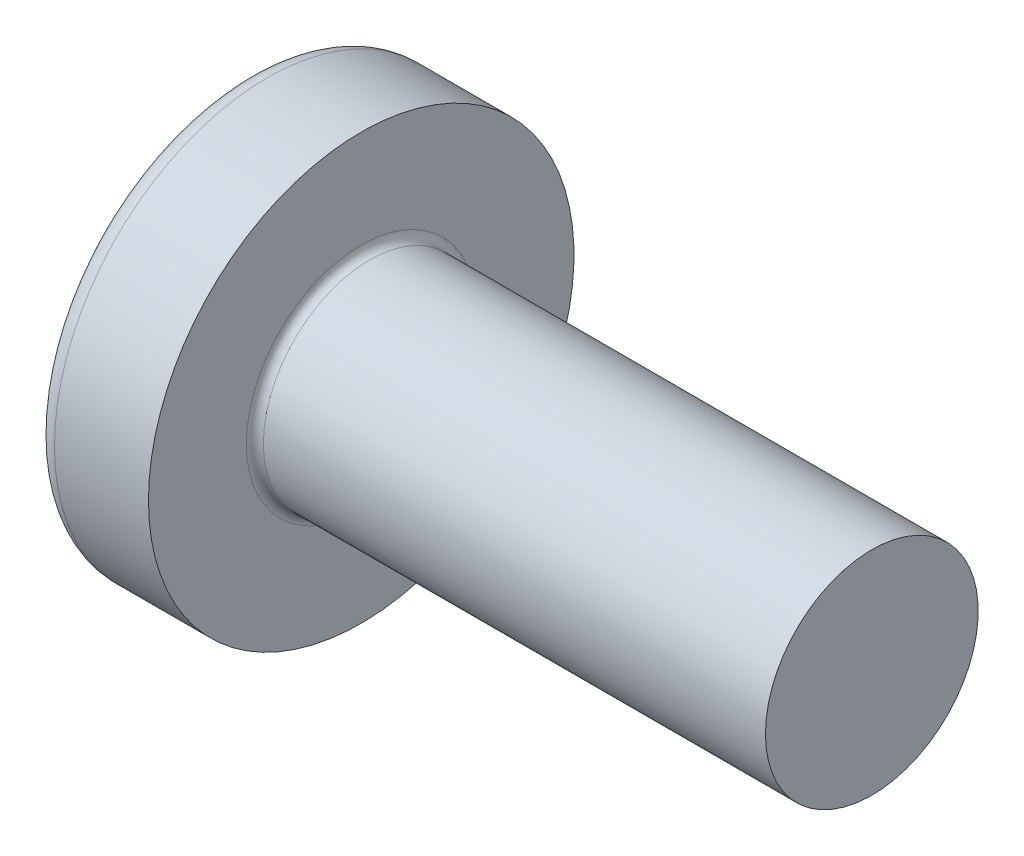
ISO-10303-21;
HEADER;
FILE_DESCRIPTION(('STEP AP214'),'2;1');
FILE_NAME('part.step','',(''),(''),'','','');
FILE_SCHEMA(('AUTOMOTIVE_DESIGN { 1 0 10303 214 1 1 1 1 }'));
ENDSEC;
DATA;
#1=APPLICATION_CONTEXT('core data for automotive mechanical design processes');
#2=APPLICATION_PROTOCOL_DEFINITION('international standard','automotive_design',2000,#1);
#3=PRODUCT_CONTEXT('',#1,'mechanical');
#4=PRODUCT('Part','Part','',(#3));
#5=PRODUCT_RELATED_PRODUCT_CATEGORY('part','',(#4));
#6=PRODUCT_DEFINITION_FORMATION('','',#4);
#7=PRODUCT_DEFINITION_CONTEXT('part definition',#1,'design');
#8=PRODUCT_DEFINITION('design','',#6,#7);
#9=PRODUCT_DEFINITION_SHAPE('','',#8);
#10=(LENGTH_UNIT() NAMED_UNIT(*) SI_UNIT(.MILLI.,.METRE.));
#11=(NAMED_UNIT(*) PLANE_ANGLE_UNIT() SI_UNIT($,.RADIAN.));
#12=(NAMED_UNIT(*) SI_UNIT($,.STERADIAN.) SOLID_ANGLE_UNIT());
#13=UNCERTAINTY_MEASURE_WITH_UNIT(LENGTH_MEASURE(1.E-05),#10,'distance_accuracy_value','');
#14=(GEOMETRIC_REPRESENTATION_CONTEXT(3) GLOBAL_UNCERTAINTY_ASSIGNED_CONTEXT((#13)) GLOBAL_UNIT_ASSIGNED_CONTEXT((#10,
#11,#12)) REPRESENTATION_CONTEXT('',''));
#15=CARTESIAN_POINT('',(0.,0.,0.));
#16=DIRECTION('',(0.,0.,1.));
#17=DIRECTION('',(1.,0.,0.));
#18=AXIS2_PLACEMENT_3D('',#15,#16,#17);
#19=CARTESIAN_POINT('',(4.,0.,0.));
#20=DIRECTION('',(-1.,0.,0.));
#21=DIRECTION('',(0.,1.,0.));
#22=AXIS2_PLACEMENT_3D('',#19,#20,#21);
#23=SPHERICAL_SURFACE('',#22,4.);
#24=CARTESIAN_POINT('',(0.803195914613464,0.,0.));
#25=DIRECTION('',(-1.,0.,0.));
#26=DIRECTION('',(0.,0.,1.));
#27=AXIS2_PLACEMENT_3D('',#24,#25,#26);
#28=CIRCLE('',#27,2.40425531914894);
#29=CARTESIAN_POINT('',(0.803195914613464,0.,2.40425531914894));
#30=VERTEX_POINT('',#29);
#31=EDGE_CURVE('E238',#30,#30,#28,.T.);
#32=ORIENTED_EDGE('',*,*,#31,.T.);
#33=EDGE_LOOP('',(#32));
#34=FACE_BOUND('',#33,.T.);
#35=CARTESIAN_POINT('',(0.0543400780062932,0.,0.));
#36=DIRECTION('',(1.,0.,0.));
#37=DIRECTION('',(0.,0.,-1.));
#38=AXIS2_PLACEMENT_3D('',#35,#36,#37);
#39=CIRCLE('',#38,0.657090389499513);
#40=CARTESIAN_POINT('',(0.0543400780062942,-0.369999999999998,-0.54301729251712));
#41=VERTEX_POINT('',#40);
#42=CARTESIAN_POINT('',(0.0543400780062936,-0.543017292517118,-0.37));
#43=VERTEX_POINT('',#42);
#44=EDGE_CURVE('E374',#41,#43,#39,.F.);
#45=ORIENTED_EDGE('',*,*,#44,.F.);
#46=CARTESIAN_POINT('',(4.,-0.37,0.));
#47=DIRECTION('',(0.,1.,0.));
#48=DIRECTION('',(0.,0.,1.));
#49=AXIS2_PLACEMENT_3D('',#46,#47,#48);
#50=CIRCLE('',#49,3.98285073785097);
#51=CARTESIAN_POINT('',(0.201999111211585,-0.369999999999996,-1.19928697514915));
#52=VERTEX_POINT('',#51);
#53=EDGE_CURVE('E300',#52,#41,#50,.T.);
#54=ORIENTED_EDGE('',*,*,#53,.F.);
#55=CARTESIAN_POINT('',(3.72274328891674,0.,0.556091024961349));
#56=DIRECTION('',(0.446197753347436,0.,-0.894934391398443));
#57=DIRECTION('',(-0.894934391398443,0.,-0.446197753347436));
#58=AXIS2_PLACEMENT_3D('',#55,#56,#57);
#59=CIRCLE('',#58,3.95144169742092);
#60=CARTESIAN_POINT('',(0.201999111211585,0.370000000000004,-1.19928697514915));
#61=VERTEX_POINT('',#60);
#62=EDGE_CURVE('E272',#52,#61,#59,.T.);
#63=ORIENTED_EDGE('',*,*,#62,.T.);
#64=CARTESIAN_POINT('',(4.,0.37,0.));
#65=DIRECTION('',(0.,-1.,0.));
#66=DIRECTION('',(0.,0.,-1.));
#67=AXIS2_PLACEMENT_3D('',#64,#65,#66);
#68=CIRCLE('',#67,3.98285073785097);
#69=CARTESIAN_POINT('',(0.0543400780062934,0.370000000000002,-0.543017292517118));
#70=VERTEX_POINT('',#69);
#71=EDGE_CURVE('E327',#70,#61,#68,.T.);
#72=ORIENTED_EDGE('',*,*,#71,.F.);
#73=CARTESIAN_POINT('',(0.0543400780062936,0.543017292517117,-0.37));
#74=VERTEX_POINT('',#73);
#75=EDGE_CURVE('E393',#74,#70,#39,.F.);
#76=ORIENTED_EDGE('',*,*,#75,.F.);
#77=CARTESIAN_POINT('',(4.,0.,-0.37));
#78=DIRECTION('',(0.,0.,1.));
#79=DIRECTION('',(1.,0.,0.));
#80=AXIS2_PLACEMENT_3D('',#77,#78,#79);
#81=CIRCLE('',#80,3.98285073785097);
#82=CARTESIAN_POINT('',(0.201999111211585,1.19928697514915,-0.37));
#83=VERTEX_POINT('',#82);
#84=EDGE_CURVE('E266',#83,#74,#81,.T.);
#85=ORIENTED_EDGE('',*,*,#84,.F.);
#86=CARTESIAN_POINT('',(3.72274328891675,-0.556091024961349,0.));
#87=DIRECTION('',(0.446197753347436,0.894934391398443,0.));
#88=DIRECTION('',(-0.894934391398443,0.446197753347436,0.));
#89=AXIS2_PLACEMENT_3D('',#86,#87,#88);
#90=CIRCLE('',#89,3.95144169742092);
#91=CARTESIAN_POINT('',(0.201999111211585,1.19928697514915,0.37));
#92=VERTEX_POINT('',#91);
#93=EDGE_CURVE('E269',#83,#92,#90,.T.);
#94=ORIENTED_EDGE('',*,*,#93,.T.);
#95=CARTESIAN_POINT('',(4.,0.,0.37));
#96=DIRECTION('',(0.,0.,-1.));
#97=DIRECTION('',(0.,1.,0.));
#98=AXIS2_PLACEMENT_3D('',#95,#96,#97);
#99=CIRCLE('',#98,3.98285073785097);
#100=CARTESIAN_POINT('',(0.0543400780062936,0.543017292517117,0.37));
#101=VERTEX_POINT('',#100);
#102=EDGE_CURVE('E262',#101,#92,#99,.T.);
#103=ORIENTED_EDGE('',*,*,#102,.F.);
#104=CARTESIAN_POINT('',(0.0543400780062942,0.369999999999998,0.54301729251712));
#105=VERTEX_POINT('',#104);
#106=EDGE_CURVE('E392',#105,#101,#39,.F.);
#107=ORIENTED_EDGE('',*,*,#106,.F.);
#108=CARTESIAN_POINT('',(0.201999111211584,0.369999999999996,1.19928697514916));
#109=VERTEX_POINT('',#108);
#110=EDGE_CURVE('E282',#109,#105,#68,.T.);
#111=ORIENTED_EDGE('',*,*,#110,.F.);
#112=CARTESIAN_POINT('',(3.72274328891674,0.,-0.556091024961349));
#113=DIRECTION('',(0.446197753347436,0.,0.894934391398443));
#114=DIRECTION('',(0.894934391398443,0.,-0.446197753347436));
#115=AXIS2_PLACEMENT_3D('',#112,#113,#114);
#116=CIRCLE('',#115,3.95144169742092);
#117=CARTESIAN_POINT('',(0.201999111211584,-0.370000000000004,1.19928697514915));
#118=VERTEX_POINT('',#117);
#119=EDGE_CURVE('E49',#109,#118,#116,.T.);
#120=ORIENTED_EDGE('',*,*,#119,.T.);
#121=CARTESIAN_POINT('',(0.0543400780062935,-0.370000000000002,0.543017292517118));
#122=VERTEX_POINT('',#121);
#123=EDGE_CURVE('E279',#122,#118,#50,.T.);
#124=ORIENTED_EDGE('',*,*,#123,.F.);
#125=CARTESIAN_POINT('',(0.0543400780062936,-0.543017292517118,0.37));
#126=VERTEX_POINT('',#125);
#127=EDGE_CURVE('E432',#126,#122,#39,.F.);
#128=ORIENTED_EDGE('',*,*,#127,.F.);
#129=CARTESIAN_POINT('',(0.201999111211585,-1.19928697514915,0.37));
#130=VERTEX_POINT('',#129);
#131=EDGE_CURVE('E263',#130,#126,#99,.T.);
#132=ORIENTED_EDGE('',*,*,#131,.F.);
#133=CARTESIAN_POINT('',(3.72274328891674,0.556091024961349,0.));
#134=DIRECTION('',(0.446197753347436,-0.894934391398443,0.));
#135=DIRECTION('',(0.894934391398443,0.446197753347436,0.));
#136=AXIS2_PLACEMENT_3D('',#133,#134,#135);
#137=CIRCLE('',#136,3.95144169742092);
#138=CARTESIAN_POINT('',(0.201999111211585,-1.19928697514915,-0.37));
#139=VERTEX_POINT('',#138);
#140=EDGE_CURVE('E259',#130,#139,#137,.T.);
#141=ORIENTED_EDGE('',*,*,#140,.T.);
#142=EDGE_CURVE('E64',#43,#139,#81,.T.);
#143=ORIENTED_EDGE('',*,*,#142,.F.);
#144=EDGE_LOOP('',(#45,#54,#63,#72,#76,#85,#94,#103,#107,#111,#120,#124,#128,#132,#141,#143));
#145=FACE_BOUND('',#144,.T.);
#146=ADVANCED_FACE('F35',(#34,#145),#23,.T.);
#147=CARTESIAN_POINT('',(1.5,0.552127712987655,-0.37));
#148=DIRECTION('',(0.,0.,1.));
#149=DIRECTION('',(1.,0.,0.));
#150=AXIS2_PLACEMENT_3D('',#147,#148,#149);
#151=PLANE('',#150);
#152=ORIENTED_EDGE('',*,*,#84,.T.);
#153=CARTESIAN_POINT('',(-0.98410748766867,0.628943903399942,-0.37));
#154=CARTESIAN_POINT('',(-0.783603343008974,0.612669947295736,-0.37));
#155=CARTESIAN_POINT('',(-0.583110931104086,0.596248129681141,-0.37));
#156=CARTESIAN_POINT('',(-0.182155788452108,0.562989164841715,-0.37));
#157=CARTESIAN_POINT('',(0.0183069414735531,0.546152007726029,-0.37));
#158=CARTESIAN_POINT('',(0.419186928470486,0.511943523152247,-0.37));
#159=CARTESIAN_POINT('',(0.61960418554543,0.4945721957373,-0.37));
#160=CARTESIAN_POINT('',(1.02037173794706,0.459102589125901,-0.37));
#161=CARTESIAN_POINT('',(1.22072203423871,0.441004320904958,-0.37));
#162=CARTESIAN_POINT('',(1.53631168775258,0.411665443099266,-0.37));
#163=CARTESIAN_POINT('',(1.65158348734209,0.400774467003839,-0.37));
#164=CARTESIAN_POINT('',(1.88208360561815,0.378547148308018,-0.37));
#165=CARTESIAN_POINT('',(1.99731192452822,0.367210808029326,-0.37));
#166=CARTESIAN_POINT('',(2.22771614129237,0.343963614894723,-0.37));
#167=CARTESIAN_POINT('',(2.34289203669079,0.332052737461392,-0.37));
#168=CARTESIAN_POINT('',(2.5731581934851,0.30741320876737,-0.37));
#169=CARTESIAN_POINT('',(2.68824845325022,0.294684542317204,-0.37));
#170=CARTESIAN_POINT('',(2.80327961663798,0.281425340988554,-0.37));
#171=B_SPLINE_CURVE_WITH_KNOTS('',3,(#153,#154,#155,#156,#157,#158,#159,#160,#161,#162,#163,
#164,#165,#166,#167,#168,#169,#170),.UNSPECIFIED.,.F.,.F.,(4,2,2,2,2,2,2,2,4),(0.,
0.603490856265068,1.20699609790343,1.81050129079257,2.41399737525255,2.7613521432415,
3.1087051006963,3.45607293033825,3.80344721379854),.UNSPECIFIED.);
#172=CARTESIAN_POINT('',(1.5,0.415013252800437,-0.370000000000001));
#173=VERTEX_POINT('',#172);
#174=EDGE_CURVE('E416',#74,#173,#171,.T.);
#175=ORIENTED_EDGE('',*,*,#174,.T.);
#176=DIRECTION('',(0.,1.,0.));
#177=VECTOR('',#176,1.);
#178=CARTESIAN_POINT('',(1.5,-0.552127712987656,-0.37));
#179=LINE('',#178,#177);
#180=CARTESIAN_POINT('',(1.5,0.552127712987655,-0.37));
#181=VERTEX_POINT('',#180);
#182=EDGE_CURVE('E356',#173,#181,#179,.T.);
#183=ORIENTED_EDGE('',*,*,#182,.T.);
#184=DIRECTION('',(0.894934391398443,-0.446197753347436,0.));
#185=VECTOR('',#184,1.);
#186=CARTESIAN_POINT('',(0.,1.3,-0.37));
#187=LINE('',#186,#185);
#188=EDGE_CURVE('E239',#83,#181,#187,.T.);
#189=ORIENTED_EDGE('',*,*,#188,.F.);
#190=EDGE_LOOP('',(#152,#175,#183,#189));
#191=FACE_BOUND('',#190,.T.);
#192=ADVANCED_FACE('F194',(#191),#151,.T.);
#193=CARTESIAN_POINT('',(1.5,-0.552127712987656,-0.37));
#194=VERTEX_POINT('',#193);
#195=CARTESIAN_POINT('',(1.5,-0.415013252800437,-0.370000000000001));
#196=VERTEX_POINT('',#195);
#197=EDGE_CURVE('E247',#194,#196,#179,.T.);
#198=ORIENTED_EDGE('',*,*,#197,.T.);
#199=CARTESIAN_POINT('',(-0.98410748766867,-0.628943903399942,-0.37));
#200=CARTESIAN_POINT('',(-0.783603343008974,-0.612669947295736,-0.37));
#201=CARTESIAN_POINT('',(-0.583110931104087,-0.596248129681141,-0.37));
#202=CARTESIAN_POINT('',(-0.182155788452109,-0.562989164841715,-0.37));
#203=CARTESIAN_POINT('',(0.0183069414735524,-0.546152007726029,-0.37));
#204=CARTESIAN_POINT('',(0.419186928470486,-0.511943523152247,-0.37));
#205=CARTESIAN_POINT('',(0.619604185545429,-0.4945721957373,-0.37));
#206=CARTESIAN_POINT('',(1.02037173794705,-0.4591025891259,-0.37));
#207=CARTESIAN_POINT('',(1.22072203423871,-0.441004320904958,-0.37));
#208=CARTESIAN_POINT('',(1.53631168775258,-0.411665443099266,-0.37));
#209=CARTESIAN_POINT('',(1.65158348734209,-0.400774467003839,-0.37));
#210=CARTESIAN_POINT('',(1.88208360561815,-0.378547148308018,-0.37));
#211=CARTESIAN_POINT('',(1.99731192452822,-0.367210808029325,-0.37));
#212=CARTESIAN_POINT('',(2.22771614129237,-0.343963614894723,-0.37));
#213=CARTESIAN_POINT('',(2.34289203669079,-0.332052737461392,-0.37));
#214=CARTESIAN_POINT('',(2.5731581934851,-0.30741320876737,-0.37));
#215=CARTESIAN_POINT('',(2.68824845325022,-0.294684542317204,-0.37));
#216=CARTESIAN_POINT('',(2.80327961663798,-0.281425340988554,-0.37));
#217=B_SPLINE_CURVE_WITH_KNOTS('',3,(#199,#200,#201,#202,#203,#204,#205,#206,#207,#208,#209,
#210,#211,#212,#213,#214,#215,#216),.UNSPECIFIED.,.F.,.F.,(4,2,2,2,2,2,2,2,4),(0.,
0.603490856265068,1.20699609790343,1.81050129079257,2.41399737525255,2.7613521432415,
3.1087051006963,3.45607293033825,3.80344721379854),.UNSPECIFIED.);
#218=EDGE_CURVE('E391',#196,#43,#217,.F.);
#219=ORIENTED_EDGE('',*,*,#218,.T.);
#220=ORIENTED_EDGE('',*,*,#142,.T.);
#221=DIRECTION('',(0.894934391398443,0.446197753347436,0.));
#222=VECTOR('',#221,1.);
#223=CARTESIAN_POINT('',(0.,-1.3,-0.37));
#224=LINE('',#223,#222);
#225=EDGE_CURVE('E330',#139,#194,#224,.T.);
#226=ORIENTED_EDGE('',*,*,#225,.T.);
#227=EDGE_LOOP('',(#198,#219,#220,#226));
#228=FACE_BOUND('',#227,.T.);
#229=ADVANCED_FACE('F200',(#228),#151,.T.);
#230=CARTESIAN_POINT('',(1.5,-0.552127712987656,0.37));
#231=DIRECTION('',(0.,0.,-1.));
#232=DIRECTION('',(0.,1.,0.));
#233=AXIS2_PLACEMENT_3D('',#230,#231,#232);
#234=PLANE('',#233);
#235=DIRECTION('',(0.,-1.,0.));
#236=VECTOR('',#235,1.);
#237=CARTESIAN_POINT('',(1.5,0.552127712987656,0.37));
#238=LINE('',#237,#236);
#239=CARTESIAN_POINT('',(1.5,0.552127712987655,0.37));
#240=VERTEX_POINT('',#239);
#241=CARTESIAN_POINT('',(1.5,0.415013252800437,0.370000000000001));
#242=VERTEX_POINT('',#241);
#243=EDGE_CURVE('E339',#240,#242,#238,.T.);
#244=ORIENTED_EDGE('',*,*,#243,.T.);
#245=CARTESIAN_POINT('',(-0.984107487670368,0.62894390340008,0.37));
#246=CARTESIAN_POINT('',(-0.783603343010499,0.61266994729586,0.37));
#247=CARTESIAN_POINT('',(-0.583110931105436,0.596248129681252,0.37));
#248=CARTESIAN_POINT('',(-0.18215578845311,0.562989164841799,0.37));
#249=CARTESIAN_POINT('',(0.0183069414727262,0.5461520077261,0.37));
#250=CARTESIAN_POINT('',(0.419186928470242,0.511943523152269,0.37));
#251=CARTESIAN_POINT('',(0.619604185545593,0.494572195737286,0.37));
#252=CARTESIAN_POINT('',(1.02037173794803,0.459102589125813,0.37));
#253=CARTESIAN_POINT('',(1.22072203424009,0.441004320904832,0.37));
#254=CARTESIAN_POINT('',(1.53631168775438,0.411665443099097,0.37));
#255=CARTESIAN_POINT('',(1.65158348734388,0.400774467003668,0.37));
#256=CARTESIAN_POINT('',(1.88208360561995,0.378547148307843,0.37));
#257=CARTESIAN_POINT('',(1.99731192453001,0.367210808029148,0.37));
#258=CARTESIAN_POINT('',(2.22771614129417,0.343963614894539,0.37));
#259=CARTESIAN_POINT('',(2.34289203669258,0.332052737461204,0.37));
#260=CARTESIAN_POINT('',(2.57315819348689,0.307413208767174,0.37));
#261=CARTESIAN_POINT('',(2.68824845325201,0.294684542317003,0.37));
#262=CARTESIAN_POINT('',(2.80327961663977,0.281425340988347,0.37));
#263=B_SPLINE_CURVE_WITH_KNOTS('',3,(#245,#246,#247,#248,#249,#250,#251,#252,#253,#254,#255,
#256,#257,#258,#259,#260,#261,#262),.UNSPECIFIED.,.F.,.F.,(4,2,2,2,2,2,2,2,4),(0.,
0.603490856265592,1.20699609790448,1.81050129079485,2.41399737525605,2.76135214324501,
3.1087051006998,3.45607293034176,3.80344721380205),.UNSPECIFIED.);
#264=EDGE_CURVE('E671',#242,#101,#263,.F.);
#265=ORIENTED_EDGE('',*,*,#264,.T.);
#266=ORIENTED_EDGE('',*,*,#102,.T.);
#267=DIRECTION('',(0.894934391398443,-0.446197753347436,0.));
#268=VECTOR('',#267,1.);
#269=CARTESIAN_POINT('',(0.,1.3,0.37));
#270=LINE('',#269,#268);
#271=EDGE_CURVE('E244',#92,#240,#270,.T.);
#272=ORIENTED_EDGE('',*,*,#271,.T.);
#273=EDGE_LOOP('',(#244,#265,#266,#272));
#274=FACE_BOUND('',#273,.T.);
#275=ADVANCED_FACE('F412',(#274),#234,.T.);
#276=ORIENTED_EDGE('',*,*,#131,.T.);
#277=CARTESIAN_POINT('',(-0.984107487670367,-0.62894390340008,0.37));
#278=CARTESIAN_POINT('',(-0.783603343010497,-0.61266994729586,0.37));
#279=CARTESIAN_POINT('',(-0.583110931105435,-0.596248129681252,0.37));
#280=CARTESIAN_POINT('',(-0.182155788453109,-0.562989164841799,0.37));
#281=CARTESIAN_POINT('',(0.018306941472727,-0.546152007726099,0.37));
#282=CARTESIAN_POINT('',(0.419186928470243,-0.511943523152269,0.37));
#283=CARTESIAN_POINT('',(0.619604185545594,-0.494572195737286,0.37));
#284=CARTESIAN_POINT('',(1.02037173794803,-0.459102589125813,0.37));
#285=CARTESIAN_POINT('',(1.2207220342401,-0.441004320904832,0.37));
#286=CARTESIAN_POINT('',(1.53631168775438,-0.411665443099097,0.37));
#287=CARTESIAN_POINT('',(1.65158348734389,-0.400774467003668,0.37));
#288=CARTESIAN_POINT('',(1.88208360561995,-0.378547148307843,0.37));
#289=CARTESIAN_POINT('',(1.99731192453001,-0.367210808029148,0.37));
#290=CARTESIAN_POINT('',(2.22771614129417,-0.343963614894539,0.37));
#291=CARTESIAN_POINT('',(2.34289203669258,-0.332052737461204,0.37));
#292=CARTESIAN_POINT('',(2.57315819348689,-0.307413208767175,0.37));
#293=CARTESIAN_POINT('',(2.68824845325201,-0.294684542317003,0.37));
#294=CARTESIAN_POINT('',(2.80327961663977,-0.281425340988347,0.37));
#295=B_SPLINE_CURVE_WITH_KNOTS('',3,(#277,#278,#279,#280,#281,#282,#283,#284,#285,#286,#287,
#288,#289,#290,#291,#292,#293,#294),.UNSPECIFIED.,.F.,.F.,(4,2,2,2,2,2,2,2,4),(0.,
0.603490856265593,1.20699609790448,1.81050129079485,2.41399737525605,2.76135214324501,
3.1087051006998,3.45607293034176,3.80344721380205),.UNSPECIFIED.);
#296=CARTESIAN_POINT('',(1.5,-0.415013252800437,0.370000000000001));
#297=VERTEX_POINT('',#296);
#298=EDGE_CURVE('E433',#126,#297,#295,.T.);
#299=ORIENTED_EDGE('',*,*,#298,.T.);
#300=CARTESIAN_POINT('',(1.5,-0.552127712987656,0.37));
#301=VERTEX_POINT('',#300);
#302=EDGE_CURVE('E341',#297,#301,#238,.T.);
#303=ORIENTED_EDGE('',*,*,#302,.T.);
#304=DIRECTION('',(0.894934391398443,0.446197753347436,0.));
#305=VECTOR('',#304,1.);
#306=CARTESIAN_POINT('',(0.,-1.3,0.37));
#307=LINE('',#306,#305);
#308=EDGE_CURVE('E332',#130,#301,#307,.T.);
#309=ORIENTED_EDGE('',*,*,#308,.F.);
#310=EDGE_LOOP('',(#276,#299,#303,#309));
#311=FACE_BOUND('',#310,.T.);
#312=ADVANCED_FACE('F519',(#311),#234,.T.);
#313=CARTESIAN_POINT('',(1.5,0.552127712987656,0.37));
#314=DIRECTION('',(0.446197753347436,0.894934391398443,0.));
#315=DIRECTION('',(-0.894934391398443,0.446197753347436,0.));
#316=AXIS2_PLACEMENT_3D('',#313,#314,#315);
#317=PLANE('',#316);
#318=CARTESIAN_POINT('',(2.47007552564217,0.0684659783631794,0.));
#319=DIRECTION('',(0.446197753347436,0.894934391398443,0.));
#320=DIRECTION('',(-0.894934391398443,0.446197753347436,0.));
#321=AXIS2_PLACEMENT_3D('',#318,#319,#320);
#322=ELLIPSE('',#321,1.0940568559235,0.483340636970288);
#323=CARTESIAN_POINT('',(1.5,0.552127712987657,0.0655056375514318));
#324=VERTEX_POINT('',#323);
#325=CARTESIAN_POINT('',(1.5,0.552127712987657,-0.0655056375514318));
#326=VERTEX_POINT('',#325);
#327=EDGE_CURVE('E305',#324,#326,#322,.F.);
#328=ORIENTED_EDGE('',*,*,#327,.F.);
#329=DIRECTION('',(0.,0.,-1.));
#330=VECTOR('',#329,1.);
#331=CARTESIAN_POINT('',(1.5,0.552127712987656,0.37));
#332=LINE('',#331,#330);
#333=EDGE_CURVE('E342',#240,#324,#332,.T.);
#334=ORIENTED_EDGE('',*,*,#333,.F.);
#335=ORIENTED_EDGE('',*,*,#271,.F.);
#336=ORIENTED_EDGE('',*,*,#93,.F.);
#337=ORIENTED_EDGE('',*,*,#188,.T.);
#338=EDGE_CURVE('E344',#326,#181,#332,.T.);
#339=ORIENTED_EDGE('',*,*,#338,.F.);
#340=EDGE_LOOP('',(#328,#334,#335,#336,#337,#339));
#341=FACE_BOUND('',#340,.T.);
#342=ADVANCED_FACE('F410',(#341),#317,.F.);
#343=CARTESIAN_POINT('',(0.,-1.3,-0.37));
#344=DIRECTION('',(0.446197753347436,-0.894934391398443,0.));
#345=DIRECTION('',(0.894934391398443,0.446197753347436,0.));
#346=AXIS2_PLACEMENT_3D('',#343,#344,#345);
#347=PLANE('',#346);
#348=CARTESIAN_POINT('',(2.47007552564217,-0.0684659783631794,0.));
#349=DIRECTION('',(0.446197753347436,-0.894934391398443,0.));
#350=DIRECTION('',(-0.894934391398443,-0.446197753347436,0.));
#351=AXIS2_PLACEMENT_3D('',#348,#349,#350);
#352=ELLIPSE('',#351,1.0940568559235,0.483340636970288);
#353=CARTESIAN_POINT('',(1.5,-0.552127712987657,-0.0655056375514327));
#354=VERTEX_POINT('',#353);
#355=CARTESIAN_POINT('',(1.5,-0.552127712987657,0.0655056375514325));
#356=VERTEX_POINT('',#355);
#357=EDGE_CURVE('E673',#354,#356,#352,.F.);
#358=ORIENTED_EDGE('',*,*,#357,.F.);
#359=DIRECTION('',(0.,0.,1.));
#360=VECTOR('',#359,1.);
#361=CARTESIAN_POINT('',(1.5,-0.552127712987656,-0.37));
#362=LINE('',#361,#360);
#363=EDGE_CURVE('E335',#194,#354,#362,.T.);
#364=ORIENTED_EDGE('',*,*,#363,.F.);
#365=ORIENTED_EDGE('',*,*,#225,.F.);
#366=ORIENTED_EDGE('',*,*,#140,.F.);
#367=ORIENTED_EDGE('',*,*,#308,.T.);
#368=EDGE_CURVE('E338',#356,#301,#362,.T.);
#369=ORIENTED_EDGE('',*,*,#368,.F.);
#370=EDGE_LOOP('',(#358,#364,#365,#366,#367,#369));
#371=FACE_BOUND('',#370,.T.);
#372=ADVANCED_FACE('F506',(#371),#347,.F.);
#373=CARTESIAN_POINT('',(1.5,0.552127712987656,-0.37));
#374=DIRECTION('',(-1.,0.,0.));
#375=DIRECTION('',(0.,0.,1.));
#376=AXIS2_PLACEMENT_3D('',#373,#374,#375);
#377=PLANE('',#376);
#378=DIRECTION('',(0.,1.,0.));
#379=VECTOR('',#378,1.);
#380=CARTESIAN_POINT('',(1.5,-0.370000000000002,0.552127712987654));
#381=LINE('',#380,#379);
#382=CARTESIAN_POINT('',(1.5,-0.370000000000002,0.552127712987654));
#383=VERTEX_POINT('',#382);
#384=CARTESIAN_POINT('',(1.5,-0.0655056375514445,0.552127712987656));
#385=VERTEX_POINT('',#384);
#386=EDGE_CURVE('E320',#383,#385,#381,.T.);
#387=ORIENTED_EDGE('',*,*,#386,.T.);
#388=CARTESIAN_POINT('',(1.5,0.,0.));
#389=DIRECTION('',(-1.,0.,0.));
#390=DIRECTION('',(0.,0.,1.));
#391=AXIS2_PLACEMENT_3D('',#388,#389,#390);
#392=CIRCLE('',#391,0.556);
#393=CARTESIAN_POINT('',(1.5,-0.370000000000001,0.415013252800436));
#394=VERTEX_POINT('',#393);
#395=EDGE_CURVE('E701',#394,#385,#392,.T.);
#396=ORIENTED_EDGE('',*,*,#395,.F.);
#397=DIRECTION('',(0.,0.,-1.));
#398=VECTOR('',#397,1.);
#399=CARTESIAN_POINT('',(1.5,-0.370000000000002,0.552127712987654));
#400=LINE('',#399,#398);
#401=EDGE_CURVE('E316',#383,#394,#400,.T.);
#402=ORIENTED_EDGE('',*,*,#401,.F.);
#403=EDGE_LOOP('',(#387,#396,#402));
#404=FACE_BOUND('',#403,.T.);
#405=ADVANCED_FACE('F499',(#404),#377,.T.);
#406=ORIENTED_EDGE('',*,*,#302,.F.);
#407=EDGE_CURVE('E706',#356,#297,#392,.T.);
#408=ORIENTED_EDGE('',*,*,#407,.F.);
#409=ORIENTED_EDGE('',*,*,#368,.T.);
#410=EDGE_LOOP('',(#406,#408,#409));
#411=FACE_BOUND('',#410,.T.);
#412=ADVANCED_FACE('F492',(#411),#377,.T.);
#413=ORIENTED_EDGE('',*,*,#363,.T.);
#414=EDGE_CURVE('E385',#196,#354,#392,.T.);
#415=ORIENTED_EDGE('',*,*,#414,.F.);
#416=ORIENTED_EDGE('',*,*,#197,.F.);
#417=EDGE_LOOP('',(#413,#415,#416));
#418=FACE_BOUND('',#417,.T.);
#419=ADVANCED_FACE('F486',(#418),#377,.T.);
#420=CARTESIAN_POINT('',(1.5,-0.369999999999998,-0.415013252800437));
#421=VERTEX_POINT('',#420);
#422=CARTESIAN_POINT('',(1.5,-0.369999999999998,-0.552127712987657));
#423=VERTEX_POINT('',#422);
#424=EDGE_CURVE('E319',#421,#423,#400,.T.);
#425=ORIENTED_EDGE('',*,*,#424,.F.);
#426=CARTESIAN_POINT('',(1.5,-0.0655056375514398,-0.552127712987656));
#427=VERTEX_POINT('',#426);
#428=EDGE_CURVE('E56',#427,#421,#392,.T.);
#429=ORIENTED_EDGE('',*,*,#428,.F.);
#430=DIRECTION('',(0.,-1.,0.));
#431=VECTOR('',#430,1.);
#432=CARTESIAN_POINT('',(1.5,0.370000000000002,-0.552127712987654));
#433=LINE('',#432,#431);
#434=EDGE_CURVE('E315',#427,#423,#433,.T.);
#435=ORIENTED_EDGE('',*,*,#434,.T.);
#436=EDGE_LOOP('',(#425,#429,#435));
#437=FACE_BOUND('',#436,.T.);
#438=ADVANCED_FACE('F380',(#437),#377,.T.);
#439=CARTESIAN_POINT('',(1.5,0.370000000000002,-0.552127712987654));
#440=VERTEX_POINT('',#439);
#441=CARTESIAN_POINT('',(1.5,0.0655056375514436,-0.552127712987656));
#442=VERTEX_POINT('',#441);
#443=EDGE_CURVE('E312',#440,#442,#433,.T.);
#444=ORIENTED_EDGE('',*,*,#443,.T.);
#445=CARTESIAN_POINT('',(1.5,0.370000000000001,-0.415013252800436));
#446=VERTEX_POINT('',#445);
#447=EDGE_CURVE('E384',#446,#442,#392,.T.);
#448=ORIENTED_EDGE('',*,*,#447,.F.);
#449=DIRECTION('',(0.,0.,1.));
#450=VECTOR('',#449,1.);
#451=CARTESIAN_POINT('',(1.5,0.370000000000002,-0.552127712987654));
#452=LINE('',#451,#450);
#453=EDGE_CURVE('E324',#440,#446,#452,.T.);
#454=ORIENTED_EDGE('',*,*,#453,.F.);
#455=EDGE_LOOP('',(#444,#448,#454));
#456=FACE_BOUND('',#455,.T.);
#457=ADVANCED_FACE('F474',(#456),#377,.T.);
#458=ORIENTED_EDGE('',*,*,#182,.F.);
#459=EDGE_CURVE('E690',#326,#173,#392,.T.);
#460=ORIENTED_EDGE('',*,*,#459,.F.);
#461=ORIENTED_EDGE('',*,*,#338,.T.);
#462=EDGE_LOOP('',(#458,#460,#461));
#463=FACE_BOUND('',#462,.T.);
#464=ADVANCED_FACE('F467',(#463),#377,.T.);
#465=ORIENTED_EDGE('',*,*,#333,.T.);
#466=EDGE_CURVE('E692',#242,#324,#392,.T.);
#467=ORIENTED_EDGE('',*,*,#466,.F.);
#468=ORIENTED_EDGE('',*,*,#243,.F.);
#469=EDGE_LOOP('',(#465,#467,#468));
#470=FACE_BOUND('',#469,.T.);
#471=ADVANCED_FACE('F461',(#470),#377,.T.);
#472=CARTESIAN_POINT('',(1.5,0.369999999999998,0.552127712987657));
#473=DIRECTION('',(0.,-1.,0.));
#474=DIRECTION('',(1.,0.,0.));
#475=AXIS2_PLACEMENT_3D('',#472,#473,#474);
#476=PLANE('',#475);
#477=ORIENTED_EDGE('',*,*,#110,.T.);
#478=CARTESIAN_POINT('',(-0.98410748766867,0.369999999999998,0.628943903399943));
#479=CARTESIAN_POINT('',(-0.783603343008974,0.369999999999998,0.612669947295737));
#480=CARTESIAN_POINT('',(-0.583110931104087,0.369999999999998,0.596248129681142));
#481=CARTESIAN_POINT('',(-0.182155788452109,0.369999999999998,0.562989164841716));
#482=CARTESIAN_POINT('',(0.0183069414735524,0.369999999999998,0.546152007726031));
#483=CARTESIAN_POINT('',(0.419186928470486,0.369999999999998,0.511943523152249));
#484=CARTESIAN_POINT('',(0.619604185545429,0.369999999999998,0.494572195737301));
#485=CARTESIAN_POINT('',(1.02037173794705,0.369999999999998,0.459102589125902));
#486=CARTESIAN_POINT('',(1.22072203423871,0.369999999999998,0.44100432090496));
#487=CARTESIAN_POINT('',(1.53631168775258,0.369999999999999,0.411665443099267));
#488=CARTESIAN_POINT('',(1.65158348734209,0.369999999999999,0.40077446700384));
#489=CARTESIAN_POINT('',(1.88208360561815,0.369999999999999,0.37854714830802));
#490=CARTESIAN_POINT('',(1.99731192452821,0.369999999999999,0.367210808029327));
#491=CARTESIAN_POINT('',(2.22771614129237,0.369999999999999,0.343963614894724));
#492=CARTESIAN_POINT('',(2.34289203669079,0.369999999999999,0.332052737461393));
#493=CARTESIAN_POINT('',(2.5731581934851,0.369999999999999,0.307413208767372));
#494=CARTESIAN_POINT('',(2.68824845325022,0.369999999999999,0.294684542317205));
#495=CARTESIAN_POINT('',(2.80327961663798,0.369999999999999,0.281425340988555));
#496=B_SPLINE_CURVE_WITH_KNOTS('',3,(#478,#479,#480,#481,#482,#483,#484,#485,#486,#487,#488,
#489,#490,#491,#492,#493,#494,#495),.UNSPECIFIED.,.F.,.F.,(4,2,2,2,2,2,2,2,4),(0.,
0.603490856265068,1.20699609790343,1.81050129079257,2.41399737525255,2.7613521432415,
3.1087051006963,3.45607293033825,3.80344721379854),.UNSPECIFIED.);
#497=CARTESIAN_POINT('',(1.5,0.369999999999999,0.415013252800439));
#498=VERTEX_POINT('',#497);
#499=EDGE_CURVE('E670',#105,#498,#496,.T.);
#500=ORIENTED_EDGE('',*,*,#499,.T.);
#501=CARTESIAN_POINT('',(1.5,0.369999999999998,0.552127712987657));
#502=VERTEX_POINT('',#501);
#503=EDGE_CURVE('E297',#498,#502,#452,.T.);
#504=ORIENTED_EDGE('',*,*,#503,.T.);
#505=DIRECTION('',(0.894934391398443,0.,-0.446197753347436));
#506=VECTOR('',#505,1.);
#507=CARTESIAN_POINT('',(0.,0.369999999999995,1.3));
#508=LINE('',#507,#506);
#509=EDGE_CURVE('E290',#109,#502,#508,.T.);
#510=ORIENTED_EDGE('',*,*,#509,.F.);
#511=EDGE_LOOP('',(#477,#500,#504,#510));
#512=FACE_BOUND('',#511,.T.);
#513=ADVANCED_FACE('F294',(#512),#476,.T.);
#514=CARTESIAN_POINT('',(1.5,-0.369999999999998,-0.552127712987657));
#515=DIRECTION('',(0.,1.,0.));
#516=DIRECTION('',(0.,0.,1.));
#517=AXIS2_PLACEMENT_3D('',#514,#515,#516);
#518=PLANE('',#517);
#519=ORIENTED_EDGE('',*,*,#401,.T.);
#520=CARTESIAN_POINT('',(-0.98410748766867,-0.370000000000002,0.62894390339994));
#521=CARTESIAN_POINT('',(-0.783603343008974,-0.370000000000002,0.612669947295735));
#522=CARTESIAN_POINT('',(-0.583110931104086,-0.370000000000002,0.59624812968114));
#523=CARTESIAN_POINT('',(-0.182155788452109,-0.370000000000002,0.562989164841714));
#524=CARTESIAN_POINT('',(0.0183069414735528,-0.370000000000002,0.546152007726028));
#525=CARTESIAN_POINT('',(0.419186928470486,-0.370000000000002,0.511943523152246));
#526=CARTESIAN_POINT('',(0.61960418554543,-0.370000000000002,0.494572195737299));
#527=CARTESIAN_POINT('',(1.02037173794706,-0.370000000000001,0.459102589125899));
#528=CARTESIAN_POINT('',(1.22072203423871,-0.370000000000001,0.441004320904957));
#529=CARTESIAN_POINT('',(1.53631168775258,-0.370000000000001,0.411665443099264));
#530=CARTESIAN_POINT('',(1.65158348734209,-0.370000000000001,0.400774467003838));
#531=CARTESIAN_POINT('',(1.88208360561815,-0.370000000000001,0.378547148308017));
#532=CARTESIAN_POINT('',(1.99731192452822,-0.370000000000001,0.367210808029324));
#533=CARTESIAN_POINT('',(2.22771614129237,-0.370000000000001,0.343963614894722));
#534=CARTESIAN_POINT('',(2.34289203669079,-0.370000000000001,0.33205273746139));
#535=CARTESIAN_POINT('',(2.5731581934851,-0.370000000000001,0.307413208767369));
#536=CARTESIAN_POINT('',(2.68824845325022,-0.370000000000001,0.294684542317202));
#537=CARTESIAN_POINT('',(2.80327961663798,-0.370000000000001,0.281425340988552));
#538=B_SPLINE_CURVE_WITH_KNOTS('',3,(#520,#521,#522,#523,#524,#525,#526,#527,#528,#529,#530,
#531,#532,#533,#534,#535,#536,#537),.UNSPECIFIED.,.F.,.F.,(4,2,2,2,2,2,2,2,4),(0.,
0.603490856265068,1.20699609790343,1.81050129079257,2.41399737525255,2.7613521432415,
3.1087051006963,3.45607293033825,3.80344721379854),.UNSPECIFIED.);
#539=EDGE_CURVE('E425',#394,#122,#538,.F.);
#540=ORIENTED_EDGE('',*,*,#539,.T.);
#541=ORIENTED_EDGE('',*,*,#123,.T.);
#542=DIRECTION('',(0.894934391398443,0.,-0.446197753347436));
#543=VECTOR('',#542,1.);
#544=CARTESIAN_POINT('',(0.,-0.370000000000005,1.3));
#545=LINE('',#544,#543);
#546=EDGE_CURVE('E292',#118,#383,#545,.T.);
#547=ORIENTED_EDGE('',*,*,#546,.T.);
#548=EDGE_LOOP('',(#519,#540,#541,#547));
#549=FACE_BOUND('',#548,.T.);
#550=ADVANCED_FACE('F229',(#549),#518,.T.);
#551=CARTESIAN_POINT('',(1.5,-0.370000000000002,0.552127712987654));
#552=DIRECTION('',(0.446197753347436,0.,0.894934391398443));
#553=DIRECTION('',(-0.894934391398443,0.,0.446197753347436));
#554=AXIS2_PLACEMENT_3D('',#551,#552,#553);
#555=PLANE('',#554);
#556=CARTESIAN_POINT('',(2.47007552564217,0.,0.0684659783631794));
#557=DIRECTION('',(0.446197753347436,0.,0.894934391398443));
#558=DIRECTION('',(-0.894934391398443,0.,0.446197753347436));
#559=AXIS2_PLACEMENT_3D('',#556,#557,#558);
#560=ELLIPSE('',#559,1.0940568559235,0.483340636970288);
#561=CARTESIAN_POINT('',(1.5,0.0655056375514406,0.552127712987656));
#562=VERTEX_POINT('',#561);
#563=EDGE_CURVE('E423',#385,#562,#560,.F.);
#564=ORIENTED_EDGE('',*,*,#563,.F.);
#565=ORIENTED_EDGE('',*,*,#386,.F.);
#566=ORIENTED_EDGE('',*,*,#546,.F.);
#567=ORIENTED_EDGE('',*,*,#119,.F.);
#568=ORIENTED_EDGE('',*,*,#509,.T.);
#569=EDGE_CURVE('E323',#562,#502,#381,.T.);
#570=ORIENTED_EDGE('',*,*,#569,.F.);
#571=EDGE_LOOP('',(#564,#565,#566,#567,#568,#570));
#572=FACE_BOUND('',#571,.T.);
#573=ADVANCED_FACE('F288',(#572),#555,.F.);
#574=CARTESIAN_POINT('',(0.,0.370000000000005,-1.3));
#575=DIRECTION('',(0.446197753347436,0.,-0.894934391398443));
#576=DIRECTION('',(0.894934391398443,0.,0.446197753347436));
#577=AXIS2_PLACEMENT_3D('',#574,#575,#576);
#578=PLANE('',#577);
#579=CARTESIAN_POINT('',(2.47007552564217,0.,-0.0684659783631795));
#580=DIRECTION('',(0.446197753347436,0.,-0.894934391398443));
#581=DIRECTION('',(-0.894934391398443,0.,-0.446197753347436));
#582=AXIS2_PLACEMENT_3D('',#579,#580,#581);
#583=ELLIPSE('',#582,1.0940568559235,0.483340636970288);
#584=EDGE_CURVE('E378',#442,#427,#583,.F.);
#585=ORIENTED_EDGE('',*,*,#584,.F.);
#586=ORIENTED_EDGE('',*,*,#443,.F.);
#587=DIRECTION('',(0.894934391398443,0.,0.446197753347436));
#588=VECTOR('',#587,1.);
#589=CARTESIAN_POINT('',(0.,0.370000000000005,-1.3));
#590=LINE('',#589,#588);
#591=EDGE_CURVE('E302',#61,#440,#590,.T.);
#592=ORIENTED_EDGE('',*,*,#591,.F.);
#593=ORIENTED_EDGE('',*,*,#62,.F.);
#594=DIRECTION('',(0.894934391398443,0.,0.446197753347436));
#595=VECTOR('',#594,1.);
#596=CARTESIAN_POINT('',(0.,-0.369999999999995,-1.3));
#597=LINE('',#596,#595);
#598=EDGE_CURVE('E309',#52,#423,#597,.T.);
#599=ORIENTED_EDGE('',*,*,#598,.T.);
#600=ORIENTED_EDGE('',*,*,#434,.F.);
#601=EDGE_LOOP('',(#585,#586,#592,#593,#599,#600));
#602=FACE_BOUND('',#601,.T.);
#603=ADVANCED_FACE('F369',(#602),#578,.F.);
#604=ORIENTED_EDGE('',*,*,#453,.T.);
#605=CARTESIAN_POINT('',(-0.984107487670367,0.370000000000002,-0.628943903400078));
#606=CARTESIAN_POINT('',(-0.783603343010497,0.370000000000002,-0.612669947295859));
#607=CARTESIAN_POINT('',(-0.583110931105435,0.370000000000002,-0.596248129681251));
#608=CARTESIAN_POINT('',(-0.182155788453109,0.370000000000002,-0.562989164841798));
#609=CARTESIAN_POINT('',(0.0183069414727269,0.370000000000002,-0.546152007726098));
#610=CARTESIAN_POINT('',(0.419186928470243,0.370000000000002,-0.511943523152268));
#611=CARTESIAN_POINT('',(0.619604185545594,0.370000000000002,-0.494572195737285));
#612=CARTESIAN_POINT('',(1.02037173794803,0.370000000000002,-0.459102589125812));
#613=CARTESIAN_POINT('',(1.2207220342401,0.370000000000001,-0.441004320904831));
#614=CARTESIAN_POINT('',(1.53631168775438,0.370000000000001,-0.411665443099096));
#615=CARTESIAN_POINT('',(1.65158348734389,0.370000000000001,-0.400774467003667));
#616=CARTESIAN_POINT('',(1.88208360561995,0.370000000000001,-0.378547148307842));
#617=CARTESIAN_POINT('',(1.99731192453001,0.370000000000001,-0.367210808029146));
#618=CARTESIAN_POINT('',(2.22771614129417,0.370000000000001,-0.343963614894538));
#619=CARTESIAN_POINT('',(2.34289203669258,0.370000000000001,-0.332052737461203));
#620=CARTESIAN_POINT('',(2.57315819348689,0.370000000000001,-0.307413208767173));
#621=CARTESIAN_POINT('',(2.68824845325201,0.370000000000001,-0.294684542317002));
#622=CARTESIAN_POINT('',(2.80327961663977,0.370000000000001,-0.281425340988346));
#623=B_SPLINE_CURVE_WITH_KNOTS('',3,(#605,#606,#607,#608,#609,#610,#611,#612,#613,#614,#615,
#616,#617,#618,#619,#620,#621,#622),.UNSPECIFIED.,.F.,.F.,(4,2,2,2,2,2,2,2,4),(0.,
0.603490856265593,1.20699609790448,1.81050129079485,2.41399737525605,2.76135214324501,
3.1087051006998,3.45607293034176,3.80344721380205),.UNSPECIFIED.);
#624=EDGE_CURVE('E365',#446,#70,#623,.F.);
#625=ORIENTED_EDGE('',*,*,#624,.T.);
#626=ORIENTED_EDGE('',*,*,#71,.T.);
#627=ORIENTED_EDGE('',*,*,#591,.T.);
#628=EDGE_LOOP('',(#604,#625,#626,#627));
#629=FACE_BOUND('',#628,.T.);
#630=ADVANCED_FACE('F227',(#629),#476,.T.);
#631=ORIENTED_EDGE('',*,*,#53,.T.);
#632=CARTESIAN_POINT('',(-0.98410748766867,-0.369999999999997,-0.628943903399943));
#633=CARTESIAN_POINT('',(-0.783603343008974,-0.369999999999998,-0.612669947295737));
#634=CARTESIAN_POINT('',(-0.583110931104086,-0.369999999999998,-0.596248129681142));
#635=CARTESIAN_POINT('',(-0.182155788452109,-0.369999999999998,-0.562989164841716));
#636=CARTESIAN_POINT('',(0.0183069414735524,-0.369999999999998,-0.546152007726031));
#637=CARTESIAN_POINT('',(0.419186928470486,-0.369999999999998,-0.511943523152249));
#638=CARTESIAN_POINT('',(0.619604185545429,-0.369999999999998,-0.494572195737301));
#639=CARTESIAN_POINT('',(1.02037173794705,-0.369999999999998,-0.459102589125902));
#640=CARTESIAN_POINT('',(1.22072203423871,-0.369999999999998,-0.441004320904959));
#641=CARTESIAN_POINT('',(1.53631168775258,-0.369999999999998,-0.411665443099267));
#642=CARTESIAN_POINT('',(1.65158348734209,-0.369999999999998,-0.40077446700384));
#643=CARTESIAN_POINT('',(1.88208360561815,-0.369999999999999,-0.37854714830802));
#644=CARTESIAN_POINT('',(1.99731192452822,-0.369999999999999,-0.367210808029327));
#645=CARTESIAN_POINT('',(2.22771614129237,-0.369999999999999,-0.343963614894724));
#646=CARTESIAN_POINT('',(2.34289203669079,-0.369999999999999,-0.332052737461393));
#647=CARTESIAN_POINT('',(2.5731581934851,-0.369999999999999,-0.307413208767372));
#648=CARTESIAN_POINT('',(2.68824845325022,-0.369999999999999,-0.294684542317205));
#649=CARTESIAN_POINT('',(2.80327961663798,-0.369999999999999,-0.281425340988555));
#650=B_SPLINE_CURVE_WITH_KNOTS('',3,(#632,#633,#634,#635,#636,#637,#638,#639,#640,#641,#642,
#643,#644,#645,#646,#647,#648,#649),.UNSPECIFIED.,.F.,.F.,(4,2,2,2,2,2,2,2,4),(0.,
0.603490856265068,1.20699609790343,1.81050129079257,2.41399737525255,2.7613521432415,
3.1087051006963,3.45607293033825,3.80344721379854),.UNSPECIFIED.);
#651=EDGE_CURVE('E11',#41,#421,#650,.T.);
#652=ORIENTED_EDGE('',*,*,#651,.T.);
#653=ORIENTED_EDGE('',*,*,#424,.T.);
#654=ORIENTED_EDGE('',*,*,#598,.F.);
#655=EDGE_LOOP('',(#631,#652,#653,#654));
#656=FACE_BOUND('',#655,.T.);
#657=ADVANCED_FACE('F222',(#656),#518,.T.);
#658=CARTESIAN_POINT('',(-25.4,0.,0.));
#659=DIRECTION('',(-1.,0.,0.));
#660=DIRECTION('',(0.,0.,1.));
#661=AXIS2_PLACEMENT_3D('',#658,#659,#660);
#662=CYLINDRICAL_SURFACE('',#661,1.25);
#663=CARTESIAN_POINT('',(2.2,0.,0.));
#664=DIRECTION('',(-1.,0.,0.));
#665=DIRECTION('',(0.,0.,1.));
#666=AXIS2_PLACEMENT_3D('',#663,#664,#665);
#667=CIRCLE('',#666,1.25);
#668=CARTESIAN_POINT('',(2.2,0.,1.25));
#669=VERTEX_POINT('',#668);
#670=EDGE_CURVE('E233',#669,#669,#667,.F.);
#671=ORIENTED_EDGE('',*,*,#670,.T.);
#672=EDGE_LOOP('',(#671));
#673=FACE_BOUND('',#672,.T.);
#674=CARTESIAN_POINT('',(8.1,0.,0.));
#675=DIRECTION('',(-1.,0.,0.));
#676=DIRECTION('',(0.,0.,1.));
#677=AXIS2_PLACEMENT_3D('',#674,#675,#676);
#678=CIRCLE('',#677,1.25);
#679=CARTESIAN_POINT('',(8.1,0.,1.25));
#680=VERTEX_POINT('',#679);
#681=EDGE_CURVE('E236',#680,#680,#678,.T.);
#682=ORIENTED_EDGE('',*,*,#681,.T.);
#683=EDGE_LOOP('',(#682));
#684=FACE_BOUND('',#683,.T.);
#685=ADVANCED_FACE('F219',(#673,#684),#662,.T.);
#686=CARTESIAN_POINT('',(2.1,1.25,0.));
#687=DIRECTION('',(-1.,0.,0.));
#688=DIRECTION('',(0.,0.,1.));
#689=AXIS2_PLACEMENT_3D('',#686,#687,#688);
#690=PLANE('',#689);
#691=CARTESIAN_POINT('',(2.1,0.,0.));
#692=DIRECTION('',(-1.,0.,0.));
#693=DIRECTION('',(0.,0.,1.));
#694=AXIS2_PLACEMENT_3D('',#691,#692,#693);
#695=CIRCLE('',#694,1.35);
#696=CARTESIAN_POINT('',(2.1,0.,1.35));
#697=VERTEX_POINT('',#696);
#698=EDGE_CURVE('E255',#697,#697,#695,.T.);
#699=ORIENTED_EDGE('',*,*,#698,.T.);
#700=EDGE_LOOP('',(#699));
#701=FACE_BOUND('',#700,.T.);
#702=CARTESIAN_POINT('',(2.1,0.,0.));
#703=DIRECTION('',(-1.,0.,0.));
#704=DIRECTION('',(0.,0.,1.));
#705=AXIS2_PLACEMENT_3D('',#702,#703,#704);
#706=CIRCLE('',#705,2.5);
#707=CARTESIAN_POINT('',(2.1,0.,2.5));
#708=VERTEX_POINT('',#707);
#709=EDGE_CURVE('E252',#708,#708,#706,.T.);
#710=ORIENTED_EDGE('',*,*,#709,.F.);
#711=EDGE_LOOP('',(#710));
#712=FACE_BOUND('',#711,.T.);
#713=ADVANCED_FACE('F216',(#701,#712),#690,.F.);
#714=CARTESIAN_POINT('',(-25.4,0.,0.));
#715=DIRECTION('',(-1.,0.,0.));
#716=DIRECTION('',(0.,0.,1.));
#717=AXIS2_PLACEMENT_3D('',#714,#715,#716);
#718=CYLINDRICAL_SURFACE('',#717,2.5);
#719=ORIENTED_EDGE('',*,*,#709,.T.);
#720=EDGE_LOOP('',(#719));
#721=FACE_BOUND('',#720,.T.);
#722=CARTESIAN_POINT('',(0.995004159736655,0.,0.));
#723=DIRECTION('',(-1.,0.,0.));
#724=DIRECTION('',(0.,0.,1.));
#725=AXIS2_PLACEMENT_3D('',#722,#723,#724);
#726=CIRCLE('',#725,2.5);
#727=CARTESIAN_POINT('',(0.995004159736655,0.,2.5));
#728=VERTEX_POINT('',#727);
#729=EDGE_CURVE('E241',#728,#728,#726,.T.);
#730=ORIENTED_EDGE('',*,*,#729,.F.);
#731=EDGE_LOOP('',(#730));
#732=FACE_BOUND('',#731,.T.);
#733=ADVANCED_FACE('F212',(#721,#732),#718,.T.);
#734=CARTESIAN_POINT('',(0.995004159736656,0.,0.));
#735=DIRECTION('',(-1.,0.,0.));
#736=DIRECTION('',(0.,0.,1.));
#737=AXIS2_PLACEMENT_3D('',#734,#735,#736);
#738=TOROIDAL_SURFACE('',#737,2.26,0.24);
#739=ORIENTED_EDGE('',*,*,#729,.T.);
#740=EDGE_LOOP('',(#739));
#741=FACE_BOUND('',#740,.T.);
#742=ORIENTED_EDGE('',*,*,#31,.F.);
#743=EDGE_LOOP('',(#742));
#744=FACE_BOUND('',#743,.T.);
#745=ADVANCED_FACE('F209',(#741,#744),#738,.T.);
#746=CARTESIAN_POINT('',(8.1,1.25,0.));
#747=DIRECTION('',(1.,0.,0.));
#748=DIRECTION('',(0.,0.,-1.));
#749=AXIS2_PLACEMENT_3D('',#746,#747,#748);
#750=PLANE('',#749);
#751=ORIENTED_EDGE('',*,*,#681,.F.);
#752=EDGE_LOOP('',(#751));
#753=FACE_BOUND('',#752,.T.);
#754=ADVANCED_FACE('F207',(#753),#750,.T.);
#755=CARTESIAN_POINT('',(2.2,0.,0.));
#756=DIRECTION('',(-1.,0.,0.));
#757=DIRECTION('',(0.,0.,1.));
#758=AXIS2_PLACEMENT_3D('',#755,#756,#757);
#759=TOROIDAL_SURFACE('',#758,1.35,0.1);
#760=ORIENTED_EDGE('',*,*,#670,.F.);
#761=EDGE_LOOP('',(#760));
#762=FACE_BOUND('',#761,.T.);
#763=ORIENTED_EDGE('',*,*,#698,.F.);
#764=EDGE_LOOP('',(#763));
#765=FACE_BOUND('',#764,.T.);
#766=ADVANCED_FACE('F37',(#762,#765),#759,.F.);
#767=ORIENTED_EDGE('',*,*,#503,.F.);
#768=EDGE_CURVE('E386',#562,#498,#392,.T.);
#769=ORIENTED_EDGE('',*,*,#768,.F.);
#770=ORIENTED_EDGE('',*,*,#569,.T.);
#771=EDGE_LOOP('',(#767,#769,#770));
#772=FACE_BOUND('',#771,.T.);
#773=ADVANCED_FACE('F468',(#772),#377,.T.);
#774=CARTESIAN_POINT('',(1.5,0.,0.));
#775=DIRECTION('',(-1.,0.,0.));
#776=DIRECTION('',(0.,0.,1.));
#777=AXIS2_PLACEMENT_3D('',#774,#775,#776);
#778=CONICAL_SURFACE('',#777,0.556,0.069813170079766);
#779=ORIENTED_EDGE('',*,*,#327,.T.);
#780=EDGE_CURVE('E687',#324,#326,#392,.T.);
#781=ORIENTED_EDGE('',*,*,#780,.F.);
#782=EDGE_LOOP('',(#779,#781));
#783=FACE_BOUND('',#782,.T.);
#784=ADVANCED_FACE('F191',(#783),#778,.F.);
#785=ORIENTED_EDGE('',*,*,#357,.T.);
#786=EDGE_CURVE('E707',#354,#356,#392,.T.);
#787=ORIENTED_EDGE('',*,*,#786,.F.);
#788=EDGE_LOOP('',(#785,#787));
#789=FACE_BOUND('',#788,.T.);
#790=ADVANCED_FACE('F601',(#789),#778,.F.);
#791=EDGE_CURVE('E388',#498,#242,#392,.T.);
#792=ORIENTED_EDGE('',*,*,#791,.F.);
#793=ORIENTED_EDGE('',*,*,#499,.F.);
#794=ORIENTED_EDGE('',*,*,#106,.T.);
#795=ORIENTED_EDGE('',*,*,#264,.F.);
#796=EDGE_LOOP('',(#792,#793,#794,#795));
#797=FACE_BOUND('',#796,.T.);
#798=ADVANCED_FACE('F607',(#797),#778,.F.);
#799=ORIENTED_EDGE('',*,*,#563,.T.);
#800=EDGE_CURVE('E389',#385,#562,#392,.T.);
#801=ORIENTED_EDGE('',*,*,#800,.F.);
#802=EDGE_LOOP('',(#799,#801));
#803=FACE_BOUND('',#802,.T.);
#804=ADVANCED_FACE('F614',(#803),#778,.F.);
#805=ORIENTED_EDGE('',*,*,#584,.T.);
#806=EDGE_CURVE('E381',#442,#427,#392,.T.);
#807=ORIENTED_EDGE('',*,*,#806,.F.);
#808=EDGE_LOOP('',(#805,#807));
#809=FACE_BOUND('',#808,.T.);
#810=ADVANCED_FACE('F621',(#809),#778,.F.);
#811=ORIENTED_EDGE('',*,*,#127,.T.);
#812=ORIENTED_EDGE('',*,*,#539,.F.);
#813=EDGE_CURVE('E703',#297,#394,#392,.T.);
#814=ORIENTED_EDGE('',*,*,#813,.F.);
#815=ORIENTED_EDGE('',*,*,#298,.F.);
#816=EDGE_LOOP('',(#811,#812,#814,#815));
#817=FACE_BOUND('',#816,.T.);
#818=ADVANCED_FACE('F628',(#817),#778,.F.);
#819=ORIENTED_EDGE('',*,*,#75,.T.);
#820=ORIENTED_EDGE('',*,*,#624,.F.);
#821=EDGE_CURVE('E693',#173,#446,#392,.T.);
#822=ORIENTED_EDGE('',*,*,#821,.F.);
#823=ORIENTED_EDGE('',*,*,#174,.F.);
#824=EDGE_LOOP('',(#819,#820,#822,#823));
#825=FACE_BOUND('',#824,.T.);
#826=ADVANCED_FACE('F189',(#825),#778,.F.);
#827=EDGE_CURVE('E382',#421,#196,#392,.T.);
#828=ORIENTED_EDGE('',*,*,#827,.F.);
#829=ORIENTED_EDGE('',*,*,#651,.F.);
#830=ORIENTED_EDGE('',*,*,#44,.T.);
#831=ORIENTED_EDGE('',*,*,#218,.F.);
#832=EDGE_LOOP('',(#828,#829,#830,#831));
#833=FACE_BOUND('',#832,.T.);
#834=ADVANCED_FACE('F184',(#833),#778,.F.);
#835=CARTESIAN_POINT('',(1.68065535110549,0.,0.));
#836=DIRECTION('',(-1.,0.,0.));
#837=DIRECTION('',(0.,0.,1.));
#838=AXIS2_PLACEMENT_3D('',#835,#836,#837);
#839=CONICAL_SURFACE('',#838,0.,1.25663706143592);
#840=ORIENTED_EDGE('',*,*,#768,.T.);
#841=ORIENTED_EDGE('',*,*,#791,.T.);
#842=ORIENTED_EDGE('',*,*,#466,.T.);
#843=ORIENTED_EDGE('',*,*,#780,.T.);
#844=ORIENTED_EDGE('',*,*,#459,.T.);
#845=ORIENTED_EDGE('',*,*,#821,.T.);
#846=ORIENTED_EDGE('',*,*,#447,.T.);
#847=ORIENTED_EDGE('',*,*,#806,.T.);
#848=ORIENTED_EDGE('',*,*,#428,.T.);
#849=ORIENTED_EDGE('',*,*,#827,.T.);
#850=ORIENTED_EDGE('',*,*,#414,.T.);
#851=ORIENTED_EDGE('',*,*,#786,.T.);
#852=ORIENTED_EDGE('',*,*,#407,.T.);
#853=ORIENTED_EDGE('',*,*,#813,.T.);
#854=ORIENTED_EDGE('',*,*,#395,.T.);
#855=ORIENTED_EDGE('',*,*,#800,.T.);
#856=EDGE_LOOP('',(#840,#841,#842,#843,#844,#845,#846,#847,#848,#849,#850,#851,#852,#853,#854,#855));
#857=FACE_BOUND('',#856,.T.);
#858=CARTESIAN_POINT('',(1.68065535110549,0.,0.));
#859=VERTEX_POINT('',#858);
#860=VERTEX_LOOP('',#859);
#861=FACE_BOUND('',#860,.T.);
#862=ADVANCED_FACE('F182',(#857,#861),#839,.F.);
#863=CLOSED_SHELL('',(#146,#192,#229,#275,#312,#342,#372,#405,#412,#419,#438,#457,#464,#471,
#513,#550,#573,#603,#630,#657,#685,#713,#733,#745,#754,#766,#773,#784,#790,#798,#804,#810,#818,
#826,#834,#862));
#864=MANIFOLD_SOLID_BREP('B2',#863);
#865=ADVANCED_BREP_SHAPE_REPRESENTATION('',(#18,#864),#14);
#866=SHAPE_DEFINITION_REPRESENTATION(#9,#865);
ENDSEC;
END-ISO-10303-21;
